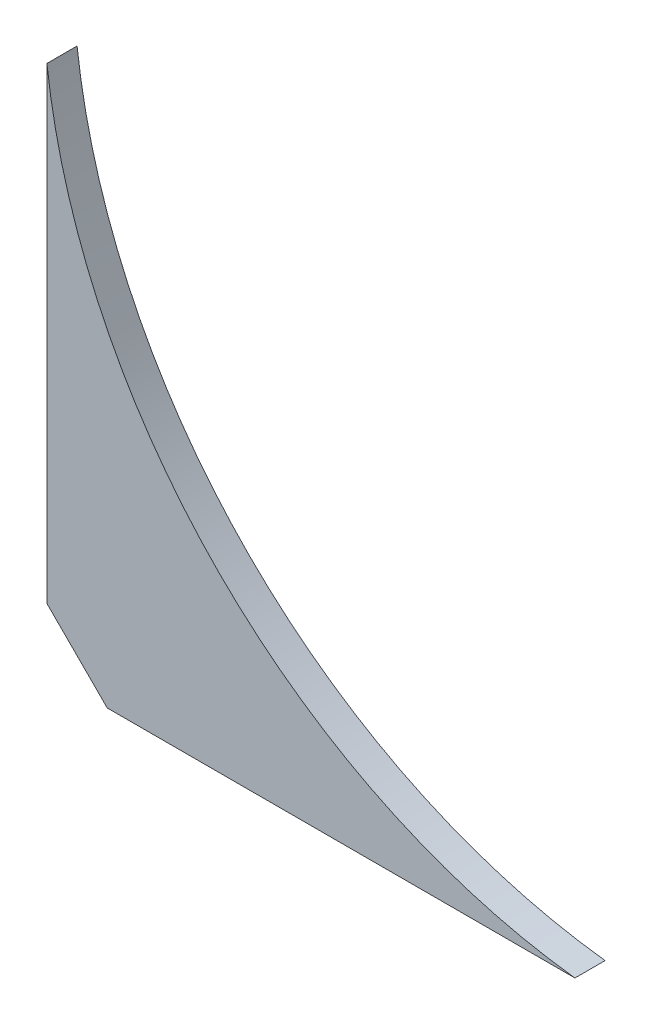
ISO-10303-21;
HEADER;
FILE_DESCRIPTION(('STEP AP214'),'2;1');
FILE_NAME('part.step','',(''),(''),'','','');
FILE_SCHEMA(('AUTOMOTIVE_DESIGN { 1 0 10303 214 1 1 1 1 }'));
ENDSEC;
DATA;
#1=APPLICATION_CONTEXT('core data for automotive mechanical design processes');
#2=APPLICATION_PROTOCOL_DEFINITION('international standard','automotive_design',2000,#1);
#3=PRODUCT_CONTEXT('',#1,'mechanical');
#4=PRODUCT('Part','Part','',(#3));
#5=PRODUCT_RELATED_PRODUCT_CATEGORY('part','',(#4));
#6=PRODUCT_DEFINITION_FORMATION('','',#4);
#7=PRODUCT_DEFINITION_CONTEXT('part definition',#1,'design');
#8=PRODUCT_DEFINITION('design','',#6,#7);
#9=PRODUCT_DEFINITION_SHAPE('','',#8);
#10=(LENGTH_UNIT() NAMED_UNIT(*) SI_UNIT(.MILLI.,.METRE.));
#11=(NAMED_UNIT(*) PLANE_ANGLE_UNIT() SI_UNIT($,.RADIAN.));
#12=(NAMED_UNIT(*) SI_UNIT($,.STERADIAN.) SOLID_ANGLE_UNIT());
#13=UNCERTAINTY_MEASURE_WITH_UNIT(LENGTH_MEASURE(1.E-05),#10,'distance_accuracy_value','');
#14=(GEOMETRIC_REPRESENTATION_CONTEXT(3) GLOBAL_UNCERTAINTY_ASSIGNED_CONTEXT((#13)) GLOBAL_UNIT_ASSIGNED_CONTEXT((#10,
#11,#12)) REPRESENTATION_CONTEXT('',''));
#15=CARTESIAN_POINT('',(0.,0.,0.));
#16=DIRECTION('',(0.,0.,1.));
#17=DIRECTION('',(1.,0.,0.));
#18=AXIS2_PLACEMENT_3D('',#15,#16,#17);
#19=CARTESIAN_POINT('',(148.43918254883,156.517455035963,5.));
#20=DIRECTION('',(0.,0.,-1.));
#21=DIRECTION('',(-1.,0.,0.));
#22=AXIS2_PLACEMENT_3D('',#19,#20,#21);
#23=CYLINDRICAL_SURFACE('',#22,200.);
#24=CARTESIAN_POINT('',(148.43918254883,156.517455035963,-5.));
#25=DIRECTION('',(0.,0.,-1.));
#26=DIRECTION('',(1.,0.,0.));
#27=AXIS2_PLACEMENT_3D('',#24,#25,#26);
#28=CIRCLE('',#27,200.);
#29=CARTESIAN_POINT('',(124.836752332385,-42.0849751804815,-5.));
#30=VERTEX_POINT('',#29);
#31=CARTESIAN_POINT('',(-50.1632476676154,132.915024819518,-5.));
#32=VERTEX_POINT('',#31);
#33=EDGE_CURVE('E93',#30,#32,#28,.T.);
#34=ORIENTED_EDGE('',*,*,#33,.T.);
#35=DIRECTION('',(0.,0.,-1.));
#36=VECTOR('',#35,1.);
#37=CARTESIAN_POINT('',(-50.1632476676154,132.915024819518,5.));
#38=LINE('',#37,#36);
#39=CARTESIAN_POINT('',(-50.1632476676154,132.915024819518,5.));
#40=VERTEX_POINT('',#39);
#41=EDGE_CURVE('E11',#40,#32,#38,.T.);
#42=ORIENTED_EDGE('',*,*,#41,.F.);
#43=CARTESIAN_POINT('',(148.43918254883,156.517455035963,5.));
#44=DIRECTION('',(0.,0.,-1.));
#45=DIRECTION('',(1.,0.,0.));
#46=AXIS2_PLACEMENT_3D('',#43,#44,#45);
#47=CIRCLE('',#46,200.);
#48=CARTESIAN_POINT('',(124.836752332385,-42.0849751804815,5.));
#49=VERTEX_POINT('',#48);
#50=EDGE_CURVE('E81',#49,#40,#47,.T.);
#51=ORIENTED_EDGE('',*,*,#50,.F.);
#52=DIRECTION('',(0.,0.,-1.));
#53=VECTOR('',#52,1.);
#54=CARTESIAN_POINT('',(124.836752332385,-42.0849751804815,5.));
#55=LINE('',#54,#53);
#56=EDGE_CURVE('E89',#49,#30,#55,.T.);
#57=ORIENTED_EDGE('',*,*,#56,.T.);
#58=EDGE_LOOP('',(#34,#42,#51,#57));
#59=FACE_BOUND('',#58,.T.);
#60=ADVANCED_FACE('F30',(#59),#23,.F.);
#61=CARTESIAN_POINT('',(-50.1632476676154,132.915024819518,5.));
#62=DIRECTION('',(1.,0.,0.));
#63=DIRECTION('',(0.,1.,0.));
#64=AXIS2_PLACEMENT_3D('',#61,#62,#63);
#65=PLANE('',#64);
#66=DIRECTION('',(0.,-1.,0.));
#67=VECTOR('',#66,1.);
#68=CARTESIAN_POINT('',(-50.1632476676154,132.915024819518,-5.));
#69=LINE('',#68,#67);
#70=CARTESIAN_POINT('',(-50.1632476676153,-22.0849751804815,-5.));
#71=VERTEX_POINT('',#70);
#72=EDGE_CURVE('E85',#32,#71,#69,.T.);
#73=ORIENTED_EDGE('',*,*,#72,.T.);
#74=DIRECTION('',(0.,0.,-1.));
#75=VECTOR('',#74,1.);
#76=CARTESIAN_POINT('',(-50.1632476676153,-22.0849751804815,5.));
#77=LINE('',#76,#75);
#78=CARTESIAN_POINT('',(-50.1632476676153,-22.0849751804815,5.));
#79=VERTEX_POINT('',#78);
#80=EDGE_CURVE('E38',#79,#71,#77,.T.);
#81=ORIENTED_EDGE('',*,*,#80,.F.);
#82=DIRECTION('',(0.,-1.,0.));
#83=VECTOR('',#82,1.);
#84=CARTESIAN_POINT('',(-50.1632476676154,132.915024819518,5.));
#85=LINE('',#84,#83);
#86=EDGE_CURVE('E76',#40,#79,#85,.T.);
#87=ORIENTED_EDGE('',*,*,#86,.F.);
#88=ORIENTED_EDGE('',*,*,#41,.T.);
#89=EDGE_LOOP('',(#73,#81,#87,#88));
#90=FACE_BOUND('',#89,.T.);
#91=ADVANCED_FACE('F84',(#90),#65,.F.);
#92=CARTESIAN_POINT('',(-50.1632476676153,-22.0849751804815,5.));
#93=DIRECTION('',(0.707106781186548,0.707106781186548,0.));
#94=DIRECTION('',(-0.707106781186548,0.707106781186548,0.));
#95=AXIS2_PLACEMENT_3D('',#92,#93,#94);
#96=PLANE('',#95);
#97=DIRECTION('',(0.707106781186548,-0.707106781186548,0.));
#98=VECTOR('',#97,1.);
#99=CARTESIAN_POINT('',(-50.1632476676153,-22.0849751804815,-5.));
#100=LINE('',#99,#98);
#101=CARTESIAN_POINT('',(-30.1632476676153,-42.0849751804815,-5.));
#102=VERTEX_POINT('',#101);
#103=EDGE_CURVE('E63',#71,#102,#100,.T.);
#104=ORIENTED_EDGE('',*,*,#103,.T.);
#105=DIRECTION('',(0.,0.,-1.));
#106=VECTOR('',#105,1.);
#107=CARTESIAN_POINT('',(-30.1632476676153,-42.0849751804815,5.));
#108=LINE('',#107,#106);
#109=CARTESIAN_POINT('',(-30.1632476676153,-42.0849751804815,5.));
#110=VERTEX_POINT('',#109);
#111=EDGE_CURVE('E86',#110,#102,#108,.T.);
#112=ORIENTED_EDGE('',*,*,#111,.F.);
#113=DIRECTION('',(0.707106781186548,-0.707106781186548,0.));
#114=VECTOR('',#113,1.);
#115=CARTESIAN_POINT('',(-50.1632476676153,-22.0849751804815,5.));
#116=LINE('',#115,#114);
#117=EDGE_CURVE('E79',#79,#110,#116,.T.);
#118=ORIENTED_EDGE('',*,*,#117,.F.);
#119=ORIENTED_EDGE('',*,*,#80,.T.);
#120=EDGE_LOOP('',(#104,#112,#118,#119));
#121=FACE_BOUND('',#120,.T.);
#122=ADVANCED_FACE('F87',(#121),#96,.F.);
#123=CARTESIAN_POINT('',(-30.1632476676153,-42.0849751804815,5.));
#124=DIRECTION('',(0.,1.,0.));
#125=DIRECTION('',(0.,0.,1.));
#126=AXIS2_PLACEMENT_3D('',#123,#124,#125);
#127=PLANE('',#126);
#128=DIRECTION('',(1.,0.,0.));
#129=VECTOR('',#128,1.);
#130=CARTESIAN_POINT('',(-30.1632476676153,-42.0849751804815,-5.));
#131=LINE('',#130,#129);
#132=EDGE_CURVE('E69',#102,#30,#131,.T.);
#133=ORIENTED_EDGE('',*,*,#132,.T.);
#134=ORIENTED_EDGE('',*,*,#56,.F.);
#135=DIRECTION('',(1.,0.,0.));
#136=VECTOR('',#135,1.);
#137=CARTESIAN_POINT('',(-30.1632476676153,-42.0849751804815,5.));
#138=LINE('',#137,#136);
#139=EDGE_CURVE('E46',#110,#49,#138,.T.);
#140=ORIENTED_EDGE('',*,*,#139,.F.);
#141=ORIENTED_EDGE('',*,*,#111,.T.);
#142=EDGE_LOOP('',(#133,#134,#140,#141));
#143=FACE_BOUND('',#142,.T.);
#144=ADVANCED_FACE('F100',(#143),#127,.F.);
#145=CARTESIAN_POINT('',(148.43918254883,156.517455035963,5.));
#146=DIRECTION('',(0.,0.,1.));
#147=DIRECTION('',(1.,0.,0.));
#148=AXIS2_PLACEMENT_3D('',#145,#146,#147);
#149=PLANE('',#148);
#150=ORIENTED_EDGE('',*,*,#50,.T.);
#151=ORIENTED_EDGE('',*,*,#86,.T.);
#152=ORIENTED_EDGE('',*,*,#117,.T.);
#153=ORIENTED_EDGE('',*,*,#139,.T.);
#154=EDGE_LOOP('',(#150,#151,#152,#153));
#155=FACE_BOUND('',#154,.T.);
#156=ADVANCED_FACE('F77',(#155),#149,.T.);
#157=CARTESIAN_POINT('',(148.43918254883,156.517455035963,-5.));
#158=DIRECTION('',(0.,0.,1.));
#159=DIRECTION('',(1.,0.,0.));
#160=AXIS2_PLACEMENT_3D('',#157,#158,#159);
#161=PLANE('',#160);
#162=ORIENTED_EDGE('',*,*,#33,.F.);
#163=ORIENTED_EDGE('',*,*,#132,.F.);
#164=ORIENTED_EDGE('',*,*,#103,.F.);
#165=ORIENTED_EDGE('',*,*,#72,.F.);
#166=EDGE_LOOP('',(#162,#163,#164,#165));
#167=FACE_BOUND('',#166,.T.);
#168=ADVANCED_FACE('F103',(#167),#161,.F.);
#169=CLOSED_SHELL('',(#60,#91,#122,#144,#156,#168));
#170=MANIFOLD_SOLID_BREP('B2',#169);
#171=ADVANCED_BREP_SHAPE_REPRESENTATION('',(#18,#170),#14);
#172=SHAPE_DEFINITION_REPRESENTATION(#9,#171);
ENDSEC;
END-ISO-10303-21;
